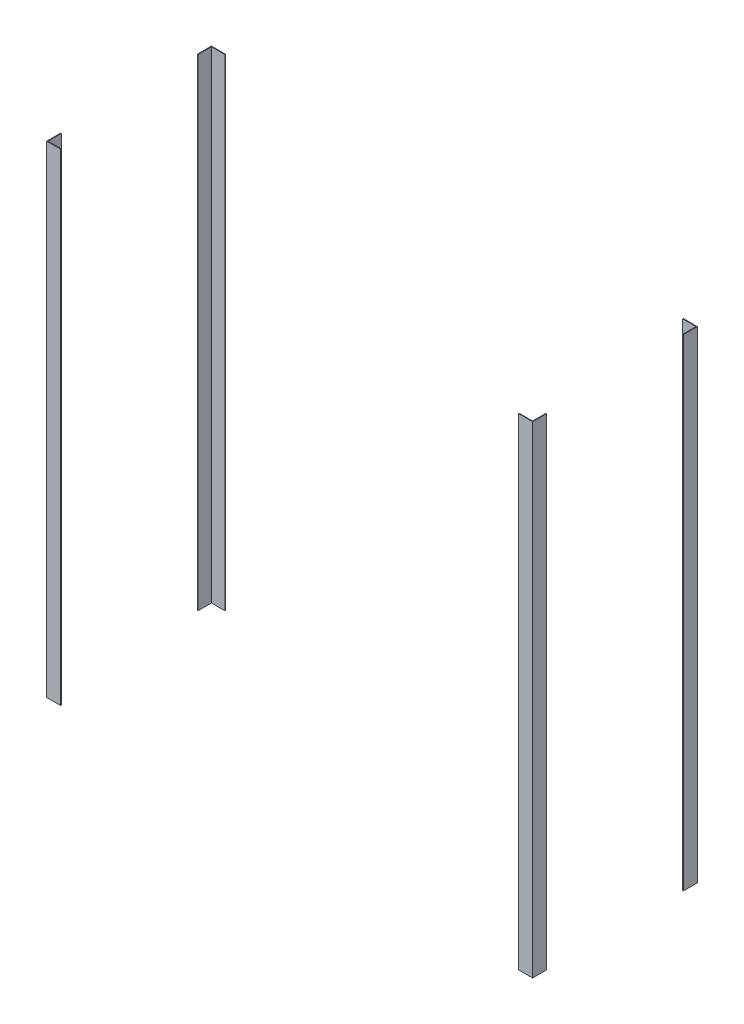
ISO-10303-21;
HEADER;
FILE_DESCRIPTION(('STEP AP214'),'2;1');
FILE_NAME('part.step','',(''),(''),'','','');
FILE_SCHEMA(('AUTOMOTIVE_DESIGN { 1 0 10303 214 1 1 1 1 }'));
ENDSEC;
DATA;
#1=APPLICATION_CONTEXT('core data for automotive mechanical design processes');
#2=APPLICATION_PROTOCOL_DEFINITION('international standard','automotive_design',2000,#1);
#3=PRODUCT_CONTEXT('',#1,'mechanical');
#4=PRODUCT('Part','Part','',(#3));
#5=PRODUCT_RELATED_PRODUCT_CATEGORY('part','',(#4));
#6=PRODUCT_DEFINITION_FORMATION('','',#4);
#7=PRODUCT_DEFINITION_CONTEXT('part definition',#1,'design');
#8=PRODUCT_DEFINITION('design','',#6,#7);
#9=PRODUCT_DEFINITION_SHAPE('','',#8);
#10=(LENGTH_UNIT() NAMED_UNIT(*) SI_UNIT(.MILLI.,.METRE.));
#11=(NAMED_UNIT(*) PLANE_ANGLE_UNIT() SI_UNIT($,.RADIAN.));
#12=(NAMED_UNIT(*) SI_UNIT($,.STERADIAN.) SOLID_ANGLE_UNIT());
#13=UNCERTAINTY_MEASURE_WITH_UNIT(LENGTH_MEASURE(1.E-05),#10,'distance_accuracy_value','');
#14=(GEOMETRIC_REPRESENTATION_CONTEXT(3) GLOBAL_UNCERTAINTY_ASSIGNED_CONTEXT((#13)) GLOBAL_UNIT_ASSIGNED_CONTEXT((#10,
#11,#12)) REPRESENTATION_CONTEXT('',''));
#15=CARTESIAN_POINT('',(0.,0.,0.));
#16=DIRECTION('',(0.,0.,1.));
#17=DIRECTION('',(1.,0.,0.));
#18=AXIS2_PLACEMENT_3D('',#15,#16,#17);
#19=CARTESIAN_POINT('',(869.15625,1828.8,312.7375));
#20=DIRECTION('',(0.,0.,-1.));
#21=DIRECTION('',(-1.,0.,0.));
#22=AXIS2_PLACEMENT_3D('',#19,#20,#21);
#23=PLANE('',#22);
#24=DIRECTION('',(1.,0.,0.));
#25=VECTOR('',#24,1.);
#26=CARTESIAN_POINT('',(869.15625,0.,312.7375));
#27=LINE('',#26,#25);
#28=CARTESIAN_POINT('',(869.15625,0.,312.7375));
#29=VERTEX_POINT('',#28);
#30=CARTESIAN_POINT('',(922.3375,0.,312.7375));
#31=VERTEX_POINT('',#30);
#32=EDGE_CURVE('E12',#29,#31,#27,.T.);
#33=ORIENTED_EDGE('',*,*,#32,.T.);
#34=DIRECTION('',(0.,-1.,0.));
#35=VECTOR('',#34,1.);
#36=CARTESIAN_POINT('',(922.3375,1828.8,312.7375));
#37=LINE('',#36,#35);
#38=CARTESIAN_POINT('',(922.3375,1828.8,312.7375));
#39=VERTEX_POINT('',#38);
#40=EDGE_CURVE('E157',#39,#31,#37,.T.);
#41=ORIENTED_EDGE('',*,*,#40,.F.);
#42=DIRECTION('',(1.,0.,0.));
#43=VECTOR('',#42,1.);
#44=CARTESIAN_POINT('',(869.15625,1828.8,312.7375));
#45=LINE('',#44,#43);
#46=CARTESIAN_POINT('',(869.15625,1828.8,312.7375));
#47=VERTEX_POINT('',#46);
#48=EDGE_CURVE('E59',#47,#39,#45,.T.);
#49=ORIENTED_EDGE('',*,*,#48,.F.);
#50=DIRECTION('',(0.,-1.,0.));
#51=VECTOR('',#50,1.);
#52=CARTESIAN_POINT('',(869.15625,1828.8,312.7375));
#53=LINE('',#52,#51);
#54=EDGE_CURVE('E145',#47,#29,#53,.T.);
#55=ORIENTED_EDGE('',*,*,#54,.T.);
#56=EDGE_LOOP('',(#33,#41,#49,#55));
#57=FACE_BOUND('',#56,.T.);
#58=ADVANCED_FACE('F55',(#57),#23,.F.);
#59=CARTESIAN_POINT('',(922.3375,1828.8,312.7375));
#60=DIRECTION('',(-1.,0.,0.));
#61=DIRECTION('',(0.,0.,1.));
#62=AXIS2_PLACEMENT_3D('',#59,#60,#61);
#63=PLANE('',#62);
#64=DIRECTION('',(0.,0.,-1.));
#65=VECTOR('',#64,1.);
#66=CARTESIAN_POINT('',(922.3375,0.,312.7375));
#67=LINE('',#66,#65);
#68=CARTESIAN_POINT('',(922.3375,0.,259.55625));
#69=VERTEX_POINT('',#68);
#70=EDGE_CURVE('E65',#31,#69,#67,.T.);
#71=ORIENTED_EDGE('',*,*,#70,.T.);
#72=DIRECTION('',(0.,-1.,0.));
#73=VECTOR('',#72,1.);
#74=CARTESIAN_POINT('',(922.3375,1828.8,259.55625));
#75=LINE('',#74,#73);
#76=CARTESIAN_POINT('',(922.3375,1828.8,259.55625));
#77=VERTEX_POINT('',#76);
#78=EDGE_CURVE('E123',#77,#69,#75,.T.);
#79=ORIENTED_EDGE('',*,*,#78,.F.);
#80=DIRECTION('',(0.,0.,-1.));
#81=VECTOR('',#80,1.);
#82=CARTESIAN_POINT('',(922.3375,1828.8,312.7375));
#83=LINE('',#82,#81);
#84=EDGE_CURVE('E95',#39,#77,#83,.T.);
#85=ORIENTED_EDGE('',*,*,#84,.F.);
#86=ORIENTED_EDGE('',*,*,#40,.T.);
#87=EDGE_LOOP('',(#71,#79,#85,#86));
#88=FACE_BOUND('',#87,.T.);
#89=ADVANCED_FACE('F158',(#88),#63,.F.);
#90=CARTESIAN_POINT('',(919.95625,1828.8,259.55625));
#91=DIRECTION('',(0.,0.,1.));
#92=DIRECTION('',(1.,0.,0.));
#93=AXIS2_PLACEMENT_3D('',#90,#91,#92);
#94=PLANE('',#93);
#95=DIRECTION('',(-1.,0.,0.));
#96=VECTOR('',#95,1.);
#97=CARTESIAN_POINT('',(919.95625,0.,259.55625));
#98=LINE('',#97,#96);
#99=CARTESIAN_POINT('',(919.95625,0.,259.55625));
#100=VERTEX_POINT('',#99);
#101=EDGE_CURVE('E117',#69,#100,#98,.T.);
#102=ORIENTED_EDGE('',*,*,#101,.T.);
#103=DIRECTION('',(0.,-1.,0.));
#104=VECTOR('',#103,1.);
#105=CARTESIAN_POINT('',(919.95625,1828.8,259.55625));
#106=LINE('',#105,#104);
#107=CARTESIAN_POINT('',(919.95625,1828.8,259.55625));
#108=VERTEX_POINT('',#107);
#109=EDGE_CURVE('E121',#108,#100,#106,.T.);
#110=ORIENTED_EDGE('',*,*,#109,.F.);
#111=DIRECTION('',(-1.,0.,0.));
#112=VECTOR('',#111,1.);
#113=CARTESIAN_POINT('',(919.95625,1828.8,259.55625));
#114=LINE('',#113,#112);
#115=EDGE_CURVE('E148',#77,#108,#114,.T.);
#116=ORIENTED_EDGE('',*,*,#115,.F.);
#117=ORIENTED_EDGE('',*,*,#78,.T.);
#118=EDGE_LOOP('',(#102,#110,#116,#117));
#119=FACE_BOUND('',#118,.T.);
#120=ADVANCED_FACE('F119',(#119),#94,.F.);
#121=CARTESIAN_POINT('',(919.95625,1828.8,310.35625));
#122=DIRECTION('',(1.,0.,0.));
#123=DIRECTION('',(0.,0.,-1.));
#124=AXIS2_PLACEMENT_3D('',#121,#122,#123);
#125=PLANE('',#124);
#126=DIRECTION('',(0.,0.,1.));
#127=VECTOR('',#126,1.);
#128=CARTESIAN_POINT('',(919.95625,0.,310.35625));
#129=LINE('',#128,#127);
#130=CARTESIAN_POINT('',(919.95625,0.,310.35625));
#131=VERTEX_POINT('',#130);
#132=EDGE_CURVE('E125',#100,#131,#129,.T.);
#133=ORIENTED_EDGE('',*,*,#132,.T.);
#134=DIRECTION('',(0.,-1.,0.));
#135=VECTOR('',#134,1.);
#136=CARTESIAN_POINT('',(919.95625,1828.8,310.35625));
#137=LINE('',#136,#135);
#138=CARTESIAN_POINT('',(919.95625,1828.8,310.35625));
#139=VERTEX_POINT('',#138);
#140=EDGE_CURVE('E132',#139,#131,#137,.T.);
#141=ORIENTED_EDGE('',*,*,#140,.F.);
#142=DIRECTION('',(0.,0.,1.));
#143=VECTOR('',#142,1.);
#144=CARTESIAN_POINT('',(919.95625,1828.8,310.35625));
#145=LINE('',#144,#143);
#146=EDGE_CURVE('E131',#108,#139,#145,.T.);
#147=ORIENTED_EDGE('',*,*,#146,.F.);
#148=ORIENTED_EDGE('',*,*,#109,.T.);
#149=EDGE_LOOP('',(#133,#141,#147,#148));
#150=FACE_BOUND('',#149,.T.);
#151=ADVANCED_FACE('F128',(#150),#125,.F.);
#152=CARTESIAN_POINT('',(869.15625,1828.8,310.35625));
#153=DIRECTION('',(0.,0.,1.));
#154=DIRECTION('',(1.,0.,0.));
#155=AXIS2_PLACEMENT_3D('',#152,#153,#154);
#156=PLANE('',#155);
#157=DIRECTION('',(-1.,0.,0.));
#158=VECTOR('',#157,1.);
#159=CARTESIAN_POINT('',(869.15625,0.,310.35625));
#160=LINE('',#159,#158);
#161=CARTESIAN_POINT('',(869.15625,0.,310.35625));
#162=VERTEX_POINT('',#161);
#163=EDGE_CURVE('E136',#131,#162,#160,.T.);
#164=ORIENTED_EDGE('',*,*,#163,.T.);
#165=DIRECTION('',(0.,-1.,0.));
#166=VECTOR('',#165,1.);
#167=CARTESIAN_POINT('',(869.15625,1828.8,310.35625));
#168=LINE('',#167,#166);
#169=CARTESIAN_POINT('',(869.15625,1828.8,310.35625));
#170=VERTEX_POINT('',#169);
#171=EDGE_CURVE('E153',#170,#162,#168,.T.);
#172=ORIENTED_EDGE('',*,*,#171,.F.);
#173=DIRECTION('',(-1.,0.,0.));
#174=VECTOR('',#173,1.);
#175=CARTESIAN_POINT('',(869.15625,1828.8,310.35625));
#176=LINE('',#175,#174);
#177=EDGE_CURVE('E144',#139,#170,#176,.T.);
#178=ORIENTED_EDGE('',*,*,#177,.F.);
#179=ORIENTED_EDGE('',*,*,#140,.T.);
#180=EDGE_LOOP('',(#164,#172,#178,#179));
#181=FACE_BOUND('',#180,.T.);
#182=ADVANCED_FACE('F165',(#181),#156,.F.);
#183=CARTESIAN_POINT('',(869.15625,1828.8,310.35625));
#184=DIRECTION('',(1.,0.,0.));
#185=DIRECTION('',(0.,0.,-1.));
#186=AXIS2_PLACEMENT_3D('',#183,#184,#185);
#187=PLANE('',#186);
#188=DIRECTION('',(0.,0.,1.));
#189=VECTOR('',#188,1.);
#190=CARTESIAN_POINT('',(869.15625,0.,310.35625));
#191=LINE('',#190,#189);
#192=EDGE_CURVE('E106',#162,#29,#191,.T.);
#193=ORIENTED_EDGE('',*,*,#192,.T.);
#194=ORIENTED_EDGE('',*,*,#54,.F.);
#195=DIRECTION('',(0.,0.,1.));
#196=VECTOR('',#195,1.);
#197=CARTESIAN_POINT('',(869.15625,1828.8,310.35625));
#198=LINE('',#197,#196);
#199=EDGE_CURVE('E142',#170,#47,#198,.T.);
#200=ORIENTED_EDGE('',*,*,#199,.F.);
#201=ORIENTED_EDGE('',*,*,#171,.T.);
#202=EDGE_LOOP('',(#193,#194,#200,#201));
#203=FACE_BOUND('',#202,.T.);
#204=ADVANCED_FACE('F161',(#203),#187,.F.);
#205=CARTESIAN_POINT('',(0.,1828.8,0.));
#206=DIRECTION('',(0.,1.,0.));
#207=DIRECTION('',(0.,0.,1.));
#208=AXIS2_PLACEMENT_3D('',#205,#206,#207);
#209=PLANE('',#208);
#210=ORIENTED_EDGE('',*,*,#48,.T.);
#211=ORIENTED_EDGE('',*,*,#84,.T.);
#212=ORIENTED_EDGE('',*,*,#115,.T.);
#213=ORIENTED_EDGE('',*,*,#146,.T.);
#214=ORIENTED_EDGE('',*,*,#177,.T.);
#215=ORIENTED_EDGE('',*,*,#199,.T.);
#216=EDGE_LOOP('',(#210,#211,#212,#213,#214,#215));
#217=FACE_BOUND('',#216,.T.);
#218=ADVANCED_FACE('F57',(#217),#209,.T.);
#219=CARTESIAN_POINT('',(0.,0.,0.));
#220=DIRECTION('',(0.,1.,0.));
#221=DIRECTION('',(0.,0.,1.));
#222=AXIS2_PLACEMENT_3D('',#219,#220,#221);
#223=PLANE('',#222);
#224=ORIENTED_EDGE('',*,*,#32,.F.);
#225=ORIENTED_EDGE('',*,*,#192,.F.);
#226=ORIENTED_EDGE('',*,*,#163,.F.);
#227=ORIENTED_EDGE('',*,*,#132,.F.);
#228=ORIENTED_EDGE('',*,*,#101,.F.);
#229=ORIENTED_EDGE('',*,*,#70,.F.);
#230=EDGE_LOOP('',(#224,#225,#226,#227,#228,#229));
#231=FACE_BOUND('',#230,.T.);
#232=ADVANCED_FACE('F135',(#231),#223,.F.);
#233=CLOSED_SHELL('',(#58,#89,#120,#151,#182,#204,#218,#232));
#234=MANIFOLD_SOLID_BREP('B2',#233);
#235=CARTESIAN_POINT('',(-922.3375,1828.8,-259.55625));
#236=DIRECTION('',(1.,0.,0.));
#237=DIRECTION('',(0.,0.,-1.));
#238=AXIS2_PLACEMENT_3D('',#235,#236,#237);
#239=PLANE('',#238);
#240=DIRECTION('',(0.,0.,1.));
#241=VECTOR('',#240,1.);
#242=CARTESIAN_POINT('',(-922.3375,0.,-259.55625));
#243=LINE('',#242,#241);
#244=CARTESIAN_POINT('',(-922.3375,0.,-312.7375));
#245=VERTEX_POINT('',#244);
#246=CARTESIAN_POINT('',(-922.3375,0.,-259.55625));
#247=VERTEX_POINT('',#246);
#248=EDGE_CURVE('E53',#245,#247,#243,.T.);
#249=ORIENTED_EDGE('',*,*,#248,.T.);
#250=DIRECTION('',(0.,-1.,0.));
#251=VECTOR('',#250,1.);
#252=CARTESIAN_POINT('',(-922.3375,1828.8,-259.55625));
#253=LINE('',#252,#251);
#254=CARTESIAN_POINT('',(-922.3375,1828.8,-259.55625));
#255=VERTEX_POINT('',#254);
#256=EDGE_CURVE('E391',#255,#247,#253,.T.);
#257=ORIENTED_EDGE('',*,*,#256,.F.);
#258=DIRECTION('',(0.,0.,1.));
#259=VECTOR('',#258,1.);
#260=CARTESIAN_POINT('',(-922.3375,1828.8,-259.55625));
#261=LINE('',#260,#259);
#262=CARTESIAN_POINT('',(-922.3375,1828.8,-312.7375));
#263=VERTEX_POINT('',#262);
#264=EDGE_CURVE('E276',#263,#255,#261,.T.);
#265=ORIENTED_EDGE('',*,*,#264,.F.);
#266=DIRECTION('',(0.,-1.,0.));
#267=VECTOR('',#266,1.);
#268=CARTESIAN_POINT('',(-922.3375,1828.8,-312.7375));
#269=LINE('',#268,#267);
#270=EDGE_CURVE('E369',#263,#245,#269,.T.);
#271=ORIENTED_EDGE('',*,*,#270,.T.);
#272=EDGE_LOOP('',(#249,#257,#265,#271));
#273=FACE_BOUND('',#272,.T.);
#274=ADVANCED_FACE('F272',(#273),#239,.F.);
#275=CARTESIAN_POINT('',(-922.3375,1828.8,-259.55625));
#276=DIRECTION('',(0.,0.,-1.));
#277=DIRECTION('',(-1.,0.,0.));
#278=AXIS2_PLACEMENT_3D('',#275,#276,#277);
#279=PLANE('',#278);
#280=DIRECTION('',(1.,0.,0.));
#281=VECTOR('',#280,1.);
#282=CARTESIAN_POINT('',(-922.3375,0.,-259.55625));
#283=LINE('',#282,#281);
#284=CARTESIAN_POINT('',(-919.95625,0.,-259.55625));
#285=VERTEX_POINT('',#284);
#286=EDGE_CURVE('E283',#247,#285,#283,.T.);
#287=ORIENTED_EDGE('',*,*,#286,.T.);
#288=DIRECTION('',(0.,-1.,0.));
#289=VECTOR('',#288,1.);
#290=CARTESIAN_POINT('',(-919.95625,1828.8,-259.55625));
#291=LINE('',#290,#289);
#292=CARTESIAN_POINT('',(-919.95625,1828.8,-259.55625));
#293=VERTEX_POINT('',#292);
#294=EDGE_CURVE('E341',#293,#285,#291,.T.);
#295=ORIENTED_EDGE('',*,*,#294,.F.);
#296=DIRECTION('',(1.,0.,0.));
#297=VECTOR('',#296,1.);
#298=CARTESIAN_POINT('',(-922.3375,1828.8,-259.55625));
#299=LINE('',#298,#297);
#300=EDGE_CURVE('E313',#255,#293,#299,.T.);
#301=ORIENTED_EDGE('',*,*,#300,.F.);
#302=ORIENTED_EDGE('',*,*,#256,.T.);
#303=EDGE_LOOP('',(#287,#295,#301,#302));
#304=FACE_BOUND('',#303,.T.);
#305=ADVANCED_FACE('F393',(#304),#279,.F.);
#306=CARTESIAN_POINT('',(-919.95625,1828.8,-259.55625));
#307=DIRECTION('',(-1.,0.,0.));
#308=DIRECTION('',(0.,0.,1.));
#309=AXIS2_PLACEMENT_3D('',#306,#307,#308);
#310=PLANE('',#309);
#311=DIRECTION('',(0.,0.,-1.));
#312=VECTOR('',#311,1.);
#313=CARTESIAN_POINT('',(-919.95625,0.,-259.55625));
#314=LINE('',#313,#312);
#315=CARTESIAN_POINT('',(-919.95625,0.,-310.35625));
#316=VERTEX_POINT('',#315);
#317=EDGE_CURVE('E335',#285,#316,#314,.T.);
#318=ORIENTED_EDGE('',*,*,#317,.T.);
#319=DIRECTION('',(0.,-1.,0.));
#320=VECTOR('',#319,1.);
#321=CARTESIAN_POINT('',(-919.95625,1828.8,-310.35625));
#322=LINE('',#321,#320);
#323=CARTESIAN_POINT('',(-919.95625,1828.8,-310.35625));
#324=VERTEX_POINT('',#323);
#325=EDGE_CURVE('E339',#324,#316,#322,.T.);
#326=ORIENTED_EDGE('',*,*,#325,.F.);
#327=DIRECTION('',(0.,0.,-1.));
#328=VECTOR('',#327,1.);
#329=CARTESIAN_POINT('',(-919.95625,1828.8,-259.55625));
#330=LINE('',#329,#328);
#331=EDGE_CURVE('E374',#293,#324,#330,.T.);
#332=ORIENTED_EDGE('',*,*,#331,.F.);
#333=ORIENTED_EDGE('',*,*,#294,.T.);
#334=EDGE_LOOP('',(#318,#326,#332,#333));
#335=FACE_BOUND('',#334,.T.);
#336=ADVANCED_FACE('F337',(#335),#310,.F.);
#337=CARTESIAN_POINT('',(-919.95625,1828.8,-310.35625));
#338=DIRECTION('',(0.,0.,-1.));
#339=DIRECTION('',(-1.,0.,0.));
#340=AXIS2_PLACEMENT_3D('',#337,#338,#339);
#341=PLANE('',#340);
#342=DIRECTION('',(1.,0.,0.));
#343=VECTOR('',#342,1.);
#344=CARTESIAN_POINT('',(-919.95625,0.,-310.35625));
#345=LINE('',#344,#343);
#346=CARTESIAN_POINT('',(-869.15625,0.,-310.35625));
#347=VERTEX_POINT('',#346);
#348=EDGE_CURVE('E344',#316,#347,#345,.T.);
#349=ORIENTED_EDGE('',*,*,#348,.T.);
#350=DIRECTION('',(0.,-1.,0.));
#351=VECTOR('',#350,1.);
#352=CARTESIAN_POINT('',(-869.15625,1828.8,-310.35625));
#353=LINE('',#352,#351);
#354=CARTESIAN_POINT('',(-869.15625,1828.8,-310.35625));
#355=VERTEX_POINT('',#354);
#356=EDGE_CURVE('E352',#355,#347,#353,.T.);
#357=ORIENTED_EDGE('',*,*,#356,.F.);
#358=DIRECTION('',(1.,0.,0.));
#359=VECTOR('',#358,1.);
#360=CARTESIAN_POINT('',(-919.95625,1828.8,-310.35625));
#361=LINE('',#360,#359);
#362=EDGE_CURVE('E350',#324,#355,#361,.T.);
#363=ORIENTED_EDGE('',*,*,#362,.F.);
#364=ORIENTED_EDGE('',*,*,#325,.T.);
#365=EDGE_LOOP('',(#349,#357,#363,#364));
#366=FACE_BOUND('',#365,.T.);
#367=ADVANCED_FACE('F347',(#366),#341,.F.);
#368=CARTESIAN_POINT('',(-869.15625,1828.8,-312.7375));
#369=DIRECTION('',(-1.,0.,0.));
#370=DIRECTION('',(0.,0.,1.));
#371=AXIS2_PLACEMENT_3D('',#368,#369,#370);
#372=PLANE('',#371);
#373=DIRECTION('',(0.,0.,-1.));
#374=VECTOR('',#373,1.);
#375=CARTESIAN_POINT('',(-869.15625,0.,-312.7375));
#376=LINE('',#375,#374);
#377=CARTESIAN_POINT('',(-869.15625,0.,-312.7375));
#378=VERTEX_POINT('',#377);
#379=EDGE_CURVE('E356',#347,#378,#376,.T.);
#380=ORIENTED_EDGE('',*,*,#379,.T.);
#381=DIRECTION('',(0.,-1.,0.));
#382=VECTOR('',#381,1.);
#383=CARTESIAN_POINT('',(-869.15625,1828.8,-312.7375));
#384=LINE('',#383,#382);
#385=CARTESIAN_POINT('',(-869.15625,1828.8,-312.7375));
#386=VERTEX_POINT('',#385);
#387=EDGE_CURVE('E384',#386,#378,#384,.T.);
#388=ORIENTED_EDGE('',*,*,#387,.F.);
#389=DIRECTION('',(0.,0.,-1.));
#390=VECTOR('',#389,1.);
#391=CARTESIAN_POINT('',(-869.15625,1828.8,-312.7375));
#392=LINE('',#391,#390);
#393=EDGE_CURVE('E368',#355,#386,#392,.T.);
#394=ORIENTED_EDGE('',*,*,#393,.F.);
#395=ORIENTED_EDGE('',*,*,#356,.T.);
#396=EDGE_LOOP('',(#380,#388,#394,#395));
#397=FACE_BOUND('',#396,.T.);
#398=ADVANCED_FACE('F400',(#397),#372,.F.);
#399=CARTESIAN_POINT('',(-922.3375,1828.8,-312.7375));
#400=DIRECTION('',(0.,0.,1.));
#401=DIRECTION('',(1.,0.,0.));
#402=AXIS2_PLACEMENT_3D('',#399,#400,#401);
#403=PLANE('',#402);
#404=DIRECTION('',(-1.,0.,0.));
#405=VECTOR('',#404,1.);
#406=CARTESIAN_POINT('',(-922.3375,0.,-312.7375));
#407=LINE('',#406,#405);
#408=EDGE_CURVE('E324',#378,#245,#407,.T.);
#409=ORIENTED_EDGE('',*,*,#408,.T.);
#410=ORIENTED_EDGE('',*,*,#270,.F.);
#411=DIRECTION('',(-1.,0.,0.));
#412=VECTOR('',#411,1.);
#413=CARTESIAN_POINT('',(-922.3375,1828.8,-312.7375));
#414=LINE('',#413,#412);
#415=EDGE_CURVE('E365',#386,#263,#414,.T.);
#416=ORIENTED_EDGE('',*,*,#415,.F.);
#417=ORIENTED_EDGE('',*,*,#387,.T.);
#418=EDGE_LOOP('',(#409,#410,#416,#417));
#419=FACE_BOUND('',#418,.T.);
#420=ADVANCED_FACE('F396',(#419),#403,.F.);
#421=CARTESIAN_POINT('',(0.,1828.8,0.));
#422=DIRECTION('',(0.,-1.,0.));
#423=DIRECTION('',(0.,0.,-1.));
#424=AXIS2_PLACEMENT_3D('',#421,#422,#423);
#425=PLANE('',#424);
#426=ORIENTED_EDGE('',*,*,#264,.T.);
#427=ORIENTED_EDGE('',*,*,#300,.T.);
#428=ORIENTED_EDGE('',*,*,#331,.T.);
#429=ORIENTED_EDGE('',*,*,#362,.T.);
#430=ORIENTED_EDGE('',*,*,#393,.T.);
#431=ORIENTED_EDGE('',*,*,#415,.T.);
#432=EDGE_LOOP('',(#426,#427,#428,#429,#430,#431));
#433=FACE_BOUND('',#432,.T.);
#434=ADVANCED_FACE('F274',(#433),#425,.F.);
#435=CARTESIAN_POINT('',(0.,0.,0.));
#436=DIRECTION('',(0.,-1.,0.));
#437=DIRECTION('',(0.,0.,-1.));
#438=AXIS2_PLACEMENT_3D('',#435,#436,#437);
#439=PLANE('',#438);
#440=ORIENTED_EDGE('',*,*,#248,.F.);
#441=ORIENTED_EDGE('',*,*,#408,.F.);
#442=ORIENTED_EDGE('',*,*,#379,.F.);
#443=ORIENTED_EDGE('',*,*,#348,.F.);
#444=ORIENTED_EDGE('',*,*,#317,.F.);
#445=ORIENTED_EDGE('',*,*,#286,.F.);
#446=EDGE_LOOP('',(#440,#441,#442,#443,#444,#445));
#447=FACE_BOUND('',#446,.T.);
#448=ADVANCED_FACE('F355',(#447),#439,.T.);
#449=CLOSED_SHELL('',(#274,#305,#336,#367,#398,#420,#434,#448));
#450=MANIFOLD_SOLID_BREP('B6',#449);
#451=CARTESIAN_POINT('',(-922.3375,1828.8,312.7375));
#452=DIRECTION('',(1.,0.,0.));
#453=DIRECTION('',(0.,0.,-1.));
#454=AXIS2_PLACEMENT_3D('',#451,#452,#453);
#455=PLANE('',#454);
#456=DIRECTION('',(0.,0.,1.));
#457=VECTOR('',#456,1.);
#458=CARTESIAN_POINT('',(-922.3375,0.,312.7375));
#459=LINE('',#458,#457);
#460=CARTESIAN_POINT('',(-922.3375,0.,259.55625));
#461=VERTEX_POINT('',#460);
#462=CARTESIAN_POINT('',(-922.3375,0.,312.7375));
#463=VERTEX_POINT('',#462);
#464=EDGE_CURVE('E270',#461,#463,#459,.T.);
#465=ORIENTED_EDGE('',*,*,#464,.T.);
#466=DIRECTION('',(0.,-1.,0.));
#467=VECTOR('',#466,1.);
#468=CARTESIAN_POINT('',(-922.3375,1828.8,312.7375));
#469=LINE('',#468,#467);
#470=CARTESIAN_POINT('',(-922.3375,1828.8,312.7375));
#471=VERTEX_POINT('',#470);
#472=EDGE_CURVE('E625',#471,#463,#469,.T.);
#473=ORIENTED_EDGE('',*,*,#472,.F.);
#474=DIRECTION('',(0.,0.,1.));
#475=VECTOR('',#474,1.);
#476=CARTESIAN_POINT('',(-922.3375,1828.8,312.7375));
#477=LINE('',#476,#475);
#478=CARTESIAN_POINT('',(-922.3375,1828.8,259.55625));
#479=VERTEX_POINT('',#478);
#480=EDGE_CURVE('E510',#479,#471,#477,.T.);
#481=ORIENTED_EDGE('',*,*,#480,.F.);
#482=DIRECTION('',(0.,-1.,0.));
#483=VECTOR('',#482,1.);
#484=CARTESIAN_POINT('',(-922.3375,1828.8,259.55625));
#485=LINE('',#484,#483);
#486=EDGE_CURVE('E603',#479,#461,#485,.T.);
#487=ORIENTED_EDGE('',*,*,#486,.T.);
#488=EDGE_LOOP('',(#465,#473,#481,#487));
#489=FACE_BOUND('',#488,.T.);
#490=ADVANCED_FACE('F506',(#489),#455,.F.);
#491=CARTESIAN_POINT('',(-922.3375,1828.8,312.7375));
#492=DIRECTION('',(0.,0.,-1.));
#493=DIRECTION('',(-1.,0.,0.));
#494=AXIS2_PLACEMENT_3D('',#491,#492,#493);
#495=PLANE('',#494);
#496=DIRECTION('',(1.,0.,0.));
#497=VECTOR('',#496,1.);
#498=CARTESIAN_POINT('',(-922.3375,0.,312.7375));
#499=LINE('',#498,#497);
#500=CARTESIAN_POINT('',(-869.15625,0.,312.7375));
#501=VERTEX_POINT('',#500);
#502=EDGE_CURVE('E517',#463,#501,#499,.T.);
#503=ORIENTED_EDGE('',*,*,#502,.T.);
#504=DIRECTION('',(0.,-1.,0.));
#505=VECTOR('',#504,1.);
#506=CARTESIAN_POINT('',(-869.15625,1828.8,312.7375));
#507=LINE('',#506,#505);
#508=CARTESIAN_POINT('',(-869.15625,1828.8,312.7375));
#509=VERTEX_POINT('',#508);
#510=EDGE_CURVE('E575',#509,#501,#507,.T.);
#511=ORIENTED_EDGE('',*,*,#510,.F.);
#512=DIRECTION('',(1.,0.,0.));
#513=VECTOR('',#512,1.);
#514=CARTESIAN_POINT('',(-922.3375,1828.8,312.7375));
#515=LINE('',#514,#513);
#516=EDGE_CURVE('E547',#471,#509,#515,.T.);
#517=ORIENTED_EDGE('',*,*,#516,.F.);
#518=ORIENTED_EDGE('',*,*,#472,.T.);
#519=EDGE_LOOP('',(#503,#511,#517,#518));
#520=FACE_BOUND('',#519,.T.);
#521=ADVANCED_FACE('F627',(#520),#495,.F.);
#522=CARTESIAN_POINT('',(-869.15625,1828.8,310.35625));
#523=DIRECTION('',(-1.,0.,0.));
#524=DIRECTION('',(0.,0.,1.));
#525=AXIS2_PLACEMENT_3D('',#522,#523,#524);
#526=PLANE('',#525);
#527=DIRECTION('',(0.,0.,-1.));
#528=VECTOR('',#527,1.);
#529=CARTESIAN_POINT('',(-869.15625,0.,310.35625));
#530=LINE('',#529,#528);
#531=CARTESIAN_POINT('',(-869.15625,0.,310.35625));
#532=VERTEX_POINT('',#531);
#533=EDGE_CURVE('E569',#501,#532,#530,.T.);
#534=ORIENTED_EDGE('',*,*,#533,.T.);
#535=DIRECTION('',(0.,-1.,0.));
#536=VECTOR('',#535,1.);
#537=CARTESIAN_POINT('',(-869.15625,1828.8,310.35625));
#538=LINE('',#537,#536);
#539=CARTESIAN_POINT('',(-869.15625,1828.8,310.35625));
#540=VERTEX_POINT('',#539);
#541=EDGE_CURVE('E573',#540,#532,#538,.T.);
#542=ORIENTED_EDGE('',*,*,#541,.F.);
#543=DIRECTION('',(0.,0.,-1.));
#544=VECTOR('',#543,1.);
#545=CARTESIAN_POINT('',(-869.15625,1828.8,310.35625));
#546=LINE('',#545,#544);
#547=EDGE_CURVE('E608',#509,#540,#546,.T.);
#548=ORIENTED_EDGE('',*,*,#547,.F.);
#549=ORIENTED_EDGE('',*,*,#510,.T.);
#550=EDGE_LOOP('',(#534,#542,#548,#549));
#551=FACE_BOUND('',#550,.T.);
#552=ADVANCED_FACE('F571',(#551),#526,.F.);
#553=CARTESIAN_POINT('',(-919.95625,1828.8,310.35625));
#554=DIRECTION('',(0.,0.,1.));
#555=DIRECTION('',(1.,0.,0.));
#556=AXIS2_PLACEMENT_3D('',#553,#554,#555);
#557=PLANE('',#556);
#558=DIRECTION('',(-1.,0.,0.));
#559=VECTOR('',#558,1.);
#560=CARTESIAN_POINT('',(-919.95625,0.,310.35625));
#561=LINE('',#560,#559);
#562=CARTESIAN_POINT('',(-919.95625,0.,310.35625));
#563=VERTEX_POINT('',#562);
#564=EDGE_CURVE('E578',#532,#563,#561,.T.);
#565=ORIENTED_EDGE('',*,*,#564,.T.);
#566=DIRECTION('',(0.,-1.,0.));
#567=VECTOR('',#566,1.);
#568=CARTESIAN_POINT('',(-919.95625,1828.8,310.35625));
#569=LINE('',#568,#567);
#570=CARTESIAN_POINT('',(-919.95625,1828.8,310.35625));
#571=VERTEX_POINT('',#570);
#572=EDGE_CURVE('E586',#571,#563,#569,.T.);
#573=ORIENTED_EDGE('',*,*,#572,.F.);
#574=DIRECTION('',(-1.,0.,0.));
#575=VECTOR('',#574,1.);
#576=CARTESIAN_POINT('',(-919.95625,1828.8,310.35625));
#577=LINE('',#576,#575);
#578=EDGE_CURVE('E584',#540,#571,#577,.T.);
#579=ORIENTED_EDGE('',*,*,#578,.F.);
#580=ORIENTED_EDGE('',*,*,#541,.T.);
#581=EDGE_LOOP('',(#565,#573,#579,#580));
#582=FACE_BOUND('',#581,.T.);
#583=ADVANCED_FACE('F581',(#582),#557,.F.);
#584=CARTESIAN_POINT('',(-919.95625,1828.8,310.35625));
#585=DIRECTION('',(-1.,0.,0.));
#586=DIRECTION('',(0.,0.,1.));
#587=AXIS2_PLACEMENT_3D('',#584,#585,#586);
#588=PLANE('',#587);
#589=DIRECTION('',(0.,0.,-1.));
#590=VECTOR('',#589,1.);
#591=CARTESIAN_POINT('',(-919.95625,0.,310.35625));
#592=LINE('',#591,#590);
#593=CARTESIAN_POINT('',(-919.95625,0.,259.55625));
#594=VERTEX_POINT('',#593);
#595=EDGE_CURVE('E590',#563,#594,#592,.T.);
#596=ORIENTED_EDGE('',*,*,#595,.T.);
#597=DIRECTION('',(0.,-1.,0.));
#598=VECTOR('',#597,1.);
#599=CARTESIAN_POINT('',(-919.95625,1828.8,259.55625));
#600=LINE('',#599,#598);
#601=CARTESIAN_POINT('',(-919.95625,1828.8,259.55625));
#602=VERTEX_POINT('',#601);
#603=EDGE_CURVE('E618',#602,#594,#600,.T.);
#604=ORIENTED_EDGE('',*,*,#603,.F.);
#605=DIRECTION('',(0.,0.,-1.));
#606=VECTOR('',#605,1.);
#607=CARTESIAN_POINT('',(-919.95625,1828.8,310.35625));
#608=LINE('',#607,#606);
#609=EDGE_CURVE('E602',#571,#602,#608,.T.);
#610=ORIENTED_EDGE('',*,*,#609,.F.);
#611=ORIENTED_EDGE('',*,*,#572,.T.);
#612=EDGE_LOOP('',(#596,#604,#610,#611));
#613=FACE_BOUND('',#612,.T.);
#614=ADVANCED_FACE('F634',(#613),#588,.F.);
#615=CARTESIAN_POINT('',(-922.3375,1828.8,259.55625));
#616=DIRECTION('',(0.,0.,1.));
#617=DIRECTION('',(1.,0.,0.));
#618=AXIS2_PLACEMENT_3D('',#615,#616,#617);
#619=PLANE('',#618);
#620=DIRECTION('',(-1.,0.,0.));
#621=VECTOR('',#620,1.);
#622=CARTESIAN_POINT('',(-922.3375,0.,259.55625));
#623=LINE('',#622,#621);
#624=EDGE_CURVE('E558',#594,#461,#623,.T.);
#625=ORIENTED_EDGE('',*,*,#624,.T.);
#626=ORIENTED_EDGE('',*,*,#486,.F.);
#627=DIRECTION('',(-1.,0.,0.));
#628=VECTOR('',#627,1.);
#629=CARTESIAN_POINT('',(-922.3375,1828.8,259.55625));
#630=LINE('',#629,#628);
#631=EDGE_CURVE('E599',#602,#479,#630,.T.);
#632=ORIENTED_EDGE('',*,*,#631,.F.);
#633=ORIENTED_EDGE('',*,*,#603,.T.);
#634=EDGE_LOOP('',(#625,#626,#632,#633));
#635=FACE_BOUND('',#634,.T.);
#636=ADVANCED_FACE('F630',(#635),#619,.F.);
#637=CARTESIAN_POINT('',(0.,1828.8,0.));
#638=DIRECTION('',(0.,-1.,0.));
#639=DIRECTION('',(0.,0.,-1.));
#640=AXIS2_PLACEMENT_3D('',#637,#638,#639);
#641=PLANE('',#640);
#642=ORIENTED_EDGE('',*,*,#480,.T.);
#643=ORIENTED_EDGE('',*,*,#516,.T.);
#644=ORIENTED_EDGE('',*,*,#547,.T.);
#645=ORIENTED_EDGE('',*,*,#578,.T.);
#646=ORIENTED_EDGE('',*,*,#609,.T.);
#647=ORIENTED_EDGE('',*,*,#631,.T.);
#648=EDGE_LOOP('',(#642,#643,#644,#645,#646,#647));
#649=FACE_BOUND('',#648,.T.);
#650=ADVANCED_FACE('F508',(#649),#641,.F.);
#651=CARTESIAN_POINT('',(0.,0.,0.));
#652=DIRECTION('',(0.,-1.,0.));
#653=DIRECTION('',(0.,0.,-1.));
#654=AXIS2_PLACEMENT_3D('',#651,#652,#653);
#655=PLANE('',#654);
#656=ORIENTED_EDGE('',*,*,#464,.F.);
#657=ORIENTED_EDGE('',*,*,#624,.F.);
#658=ORIENTED_EDGE('',*,*,#595,.F.);
#659=ORIENTED_EDGE('',*,*,#564,.F.);
#660=ORIENTED_EDGE('',*,*,#533,.F.);
#661=ORIENTED_EDGE('',*,*,#502,.F.);
#662=EDGE_LOOP('',(#656,#657,#658,#659,#660,#661));
#663=FACE_BOUND('',#662,.T.);
#664=ADVANCED_FACE('F589',(#663),#655,.T.);
#665=CLOSED_SHELL('',(#490,#521,#552,#583,#614,#636,#650,#664));
#666=MANIFOLD_SOLID_BREP('B47',#665);
#667=CARTESIAN_POINT('',(922.3375,1828.8,-259.55625));
#668=DIRECTION('',(-1.,0.,0.));
#669=DIRECTION('',(0.,0.,1.));
#670=AXIS2_PLACEMENT_3D('',#667,#668,#669);
#671=PLANE('',#670);
#672=DIRECTION('',(0.,0.,-1.));
#673=VECTOR('',#672,1.);
#674=CARTESIAN_POINT('',(922.3375,0.,-259.55625));
#675=LINE('',#674,#673);
#676=CARTESIAN_POINT('',(922.3375,0.,-259.55625));
#677=VERTEX_POINT('',#676);
#678=CARTESIAN_POINT('',(922.3375,0.,-312.7375));
#679=VERTEX_POINT('',#678);
#680=EDGE_CURVE('E815',#677,#679,#675,.T.);
#681=ORIENTED_EDGE('',*,*,#680,.T.);
#682=DIRECTION('',(0.,-1.,0.));
#683=VECTOR('',#682,1.);
#684=CARTESIAN_POINT('',(922.3375,1828.8,-312.7375));
#685=LINE('',#684,#683);
#686=CARTESIAN_POINT('',(922.3375,1828.8,-312.7375));
#687=VERTEX_POINT('',#686);
#688=EDGE_CURVE('E504',#687,#679,#685,.T.);
#689=ORIENTED_EDGE('',*,*,#688,.F.);
#690=DIRECTION('',(0.,0.,-1.));
#691=VECTOR('',#690,1.);
#692=CARTESIAN_POINT('',(922.3375,1828.8,-259.55625));
#693=LINE('',#692,#691);
#694=CARTESIAN_POINT('',(922.3375,1828.8,-259.55625));
#695=VERTEX_POINT('',#694);
#696=EDGE_CURVE('E825',#695,#687,#693,.T.);
#697=ORIENTED_EDGE('',*,*,#696,.F.);
#698=DIRECTION('',(0.,-1.,0.));
#699=VECTOR('',#698,1.);
#700=CARTESIAN_POINT('',(922.3375,1828.8,-259.55625));
#701=LINE('',#700,#699);
#702=EDGE_CURVE('E811',#695,#677,#701,.T.);
#703=ORIENTED_EDGE('',*,*,#702,.T.);
#704=EDGE_LOOP('',(#681,#689,#697,#703));
#705=FACE_BOUND('',#704,.T.);
#706=ADVANCED_FACE('F731',(#705),#671,.F.);
#707=CARTESIAN_POINT('',(869.15625,1828.8,-312.7375));
#708=DIRECTION('',(0.,0.,1.));
#709=DIRECTION('',(1.,0.,0.));
#710=AXIS2_PLACEMENT_3D('',#707,#708,#709);
#711=PLANE('',#710);
#712=DIRECTION('',(-1.,0.,0.));
#713=VECTOR('',#712,1.);
#714=CARTESIAN_POINT('',(869.15625,0.,-312.7375));
#715=LINE('',#714,#713);
#716=CARTESIAN_POINT('',(869.15625,0.,-312.7375));
#717=VERTEX_POINT('',#716);
#718=EDGE_CURVE('E818',#679,#717,#715,.T.);
#719=ORIENTED_EDGE('',*,*,#718,.T.);
#720=DIRECTION('',(0.,-1.,0.));
#721=VECTOR('',#720,1.);
#722=CARTESIAN_POINT('',(869.15625,1828.8,-312.7375));
#723=LINE('',#722,#721);
#724=CARTESIAN_POINT('',(869.15625,1828.8,-312.7375));
#725=VERTEX_POINT('',#724);
#726=EDGE_CURVE('E739',#725,#717,#723,.T.);
#727=ORIENTED_EDGE('',*,*,#726,.F.);
#728=DIRECTION('',(-1.,0.,0.));
#729=VECTOR('',#728,1.);
#730=CARTESIAN_POINT('',(869.15625,1828.8,-312.7375));
#731=LINE('',#730,#729);
#732=EDGE_CURVE('E784',#687,#725,#731,.T.);
#733=ORIENTED_EDGE('',*,*,#732,.F.);
#734=ORIENTED_EDGE('',*,*,#688,.T.);
#735=EDGE_LOOP('',(#719,#727,#733,#734));
#736=FACE_BOUND('',#735,.T.);
#737=ADVANCED_FACE('F849',(#736),#711,.F.);
#738=CARTESIAN_POINT('',(869.15625,1828.8,-312.7375));
#739=DIRECTION('',(1.,0.,0.));
#740=DIRECTION('',(0.,0.,-1.));
#741=AXIS2_PLACEMENT_3D('',#738,#739,#740);
#742=PLANE('',#741);
#743=DIRECTION('',(0.,0.,1.));
#744=VECTOR('',#743,1.);
#745=CARTESIAN_POINT('',(869.15625,0.,-312.7375));
#746=LINE('',#745,#744);
#747=CARTESIAN_POINT('',(869.15625,0.,-310.35625));
#748=VERTEX_POINT('',#747);
#749=EDGE_CURVE('E820',#717,#748,#746,.T.);
#750=ORIENTED_EDGE('',*,*,#749,.T.);
#751=DIRECTION('',(0.,-1.,0.));
#752=VECTOR('',#751,1.);
#753=CARTESIAN_POINT('',(869.15625,1828.8,-310.35625));
#754=LINE('',#753,#752);
#755=CARTESIAN_POINT('',(869.15625,1828.8,-310.35625));
#756=VERTEX_POINT('',#755);
#757=EDGE_CURVE('E806',#756,#748,#754,.T.);
#758=ORIENTED_EDGE('',*,*,#757,.F.);
#759=DIRECTION('',(0.,0.,1.));
#760=VECTOR('',#759,1.);
#761=CARTESIAN_POINT('',(869.15625,1828.8,-312.7375));
#762=LINE('',#761,#760);
#763=EDGE_CURVE('E797',#725,#756,#762,.T.);
#764=ORIENTED_EDGE('',*,*,#763,.F.);
#765=ORIENTED_EDGE('',*,*,#726,.T.);
#766=EDGE_LOOP('',(#750,#758,#764,#765));
#767=FACE_BOUND('',#766,.T.);
#768=ADVANCED_FACE('F831',(#767),#742,.F.);
#769=CARTESIAN_POINT('',(869.15625,1828.8,-310.35625));
#770=DIRECTION('',(0.,0.,-1.));
#771=DIRECTION('',(-1.,0.,0.));
#772=AXIS2_PLACEMENT_3D('',#769,#770,#771);
#773=PLANE('',#772);
#774=DIRECTION('',(1.,0.,0.));
#775=VECTOR('',#774,1.);
#776=CARTESIAN_POINT('',(869.15625,0.,-310.35625));
#777=LINE('',#776,#775);
#778=CARTESIAN_POINT('',(919.95625,0.,-310.35625));
#779=VERTEX_POINT('',#778);
#780=EDGE_CURVE('E805',#748,#779,#777,.T.);
#781=ORIENTED_EDGE('',*,*,#780,.T.);
#782=DIRECTION('',(0.,-1.,0.));
#783=VECTOR('',#782,1.);
#784=CARTESIAN_POINT('',(919.95625,1828.8,-310.35625));
#785=LINE('',#784,#783);
#786=CARTESIAN_POINT('',(919.95625,1828.8,-310.35625));
#787=VERTEX_POINT('',#786);
#788=EDGE_CURVE('E802',#787,#779,#785,.T.);
#789=ORIENTED_EDGE('',*,*,#788,.F.);
#790=DIRECTION('',(1.,0.,0.));
#791=VECTOR('',#790,1.);
#792=CARTESIAN_POINT('',(869.15625,1828.8,-310.35625));
#793=LINE('',#792,#791);
#794=EDGE_CURVE('E791',#756,#787,#793,.T.);
#795=ORIENTED_EDGE('',*,*,#794,.F.);
#796=ORIENTED_EDGE('',*,*,#757,.T.);
#797=EDGE_LOOP('',(#781,#789,#795,#796));
#798=FACE_BOUND('',#797,.T.);
#799=ADVANCED_FACE('F803',(#798),#773,.F.);
#800=CARTESIAN_POINT('',(919.95625,1828.8,-259.55625));
#801=DIRECTION('',(1.,0.,0.));
#802=DIRECTION('',(0.,0.,-1.));
#803=AXIS2_PLACEMENT_3D('',#800,#801,#802);
#804=PLANE('',#803);
#805=DIRECTION('',(0.,0.,1.));
#806=VECTOR('',#805,1.);
#807=CARTESIAN_POINT('',(919.95625,0.,-259.55625));
#808=LINE('',#807,#806);
#809=CARTESIAN_POINT('',(919.95625,0.,-259.55625));
#810=VERTEX_POINT('',#809);
#811=EDGE_CURVE('E770',#779,#810,#808,.T.);
#812=ORIENTED_EDGE('',*,*,#811,.T.);
#813=DIRECTION('',(0.,-1.,0.));
#814=VECTOR('',#813,1.);
#815=CARTESIAN_POINT('',(919.95625,1828.8,-259.55625));
#816=LINE('',#815,#814);
#817=CARTESIAN_POINT('',(919.95625,1828.8,-259.55625));
#818=VERTEX_POINT('',#817);
#819=EDGE_CURVE('E807',#818,#810,#816,.T.);
#820=ORIENTED_EDGE('',*,*,#819,.F.);
#821=DIRECTION('',(0.,0.,1.));
#822=VECTOR('',#821,1.);
#823=CARTESIAN_POINT('',(919.95625,1828.8,-259.55625));
#824=LINE('',#823,#822);
#825=EDGE_CURVE('E795',#787,#818,#824,.T.);
#826=ORIENTED_EDGE('',*,*,#825,.F.);
#827=ORIENTED_EDGE('',*,*,#788,.T.);
#828=EDGE_LOOP('',(#812,#820,#826,#827));
#829=FACE_BOUND('',#828,.T.);
#830=ADVANCED_FACE('F809',(#829),#804,.F.);
#831=CARTESIAN_POINT('',(919.95625,1828.8,-259.55625));
#832=DIRECTION('',(0.,0.,-1.));
#833=DIRECTION('',(-1.,0.,0.));
#834=AXIS2_PLACEMENT_3D('',#831,#832,#833);
#835=PLANE('',#834);
#836=DIRECTION('',(1.,0.,0.));
#837=VECTOR('',#836,1.);
#838=CARTESIAN_POINT('',(919.95625,0.,-259.55625));
#839=LINE('',#838,#837);
#840=EDGE_CURVE('E776',#810,#677,#839,.T.);
#841=ORIENTED_EDGE('',*,*,#840,.T.);
#842=ORIENTED_EDGE('',*,*,#702,.F.);
#843=DIRECTION('',(1.,0.,0.));
#844=VECTOR('',#843,1.);
#845=CARTESIAN_POINT('',(919.95625,1828.8,-259.55625));
#846=LINE('',#845,#844);
#847=EDGE_CURVE('E747',#818,#695,#846,.T.);
#848=ORIENTED_EDGE('',*,*,#847,.F.);
#849=ORIENTED_EDGE('',*,*,#819,.T.);
#850=EDGE_LOOP('',(#841,#842,#848,#849));
#851=FACE_BOUND('',#850,.T.);
#852=ADVANCED_FACE('F838',(#851),#835,.F.);
#853=CARTESIAN_POINT('',(0.,1828.8,0.));
#854=DIRECTION('',(0.,-1.,0.));
#855=DIRECTION('',(0.,0.,-1.));
#856=AXIS2_PLACEMENT_3D('',#853,#854,#855);
#857=PLANE('',#856);
#858=ORIENTED_EDGE('',*,*,#696,.T.);
#859=ORIENTED_EDGE('',*,*,#732,.T.);
#860=ORIENTED_EDGE('',*,*,#763,.T.);
#861=ORIENTED_EDGE('',*,*,#794,.T.);
#862=ORIENTED_EDGE('',*,*,#825,.T.);
#863=ORIENTED_EDGE('',*,*,#847,.T.);
#864=EDGE_LOOP('',(#858,#859,#860,#861,#862,#863));
#865=FACE_BOUND('',#864,.T.);
#866=ADVANCED_FACE('F793',(#865),#857,.F.);
#867=CARTESIAN_POINT('',(0.,0.,0.));
#868=DIRECTION('',(0.,-1.,0.));
#869=DIRECTION('',(0.,0.,-1.));
#870=AXIS2_PLACEMENT_3D('',#867,#868,#869);
#871=PLANE('',#870);
#872=ORIENTED_EDGE('',*,*,#680,.F.);
#873=ORIENTED_EDGE('',*,*,#840,.F.);
#874=ORIENTED_EDGE('',*,*,#811,.F.);
#875=ORIENTED_EDGE('',*,*,#780,.F.);
#876=ORIENTED_EDGE('',*,*,#749,.F.);
#877=ORIENTED_EDGE('',*,*,#718,.F.);
#878=EDGE_LOOP('',(#872,#873,#874,#875,#876,#877));
#879=FACE_BOUND('',#878,.T.);
#880=ADVANCED_FACE('F834',(#879),#871,.T.);
#881=CLOSED_SHELL('',(#706,#737,#768,#799,#830,#852,#866,#880));
#882=MANIFOLD_SOLID_BREP('B264',#881);
#883=ADVANCED_BREP_SHAPE_REPRESENTATION('',(#18,#234,#450,#666,#882),#14);
#884=SHAPE_DEFINITION_REPRESENTATION(#9,#883);
ENDSEC;
END-ISO-10303-21;
